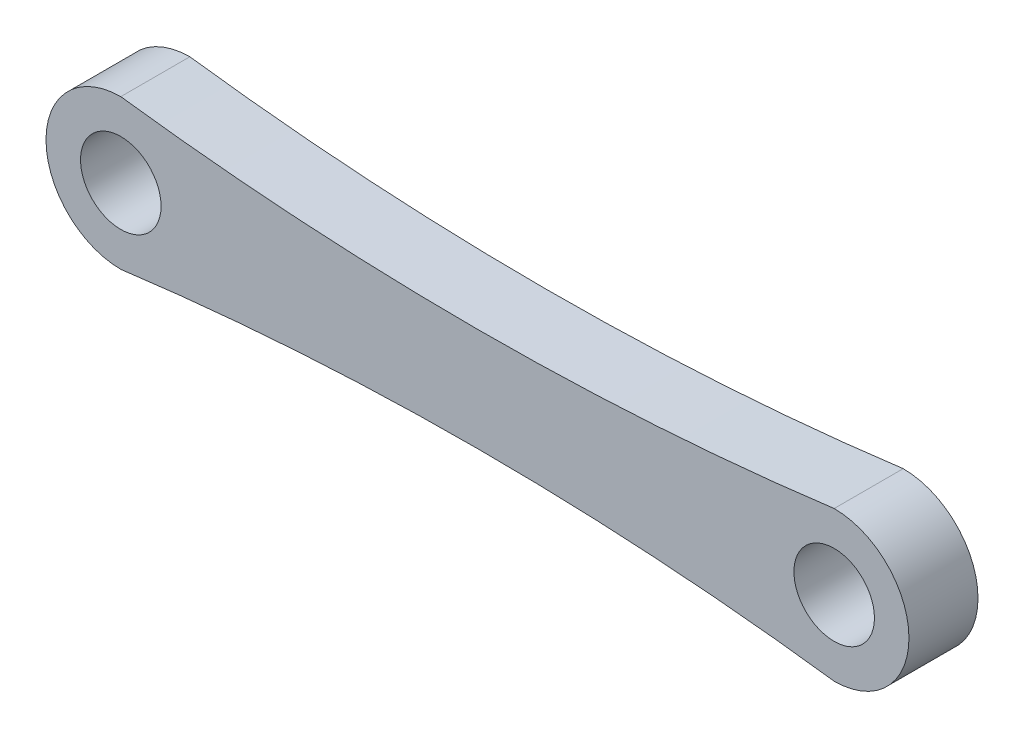
ISO-10303-21;
HEADER;
FILE_DESCRIPTION(('STEP AP214'),'2;1');
FILE_NAME('part.step','',(''),(''),'','','');
FILE_SCHEMA(('AUTOMOTIVE_DESIGN { 1 0 10303 214 1 1 1 1 }'));
ENDSEC;
DATA;
#1=APPLICATION_CONTEXT('core data for automotive mechanical design processes');
#2=APPLICATION_PROTOCOL_DEFINITION('international standard','automotive_design',2000,#1);
#3=PRODUCT_CONTEXT('',#1,'mechanical');
#4=PRODUCT('Part','Part','',(#3));
#5=PRODUCT_RELATED_PRODUCT_CATEGORY('part','',(#4));
#6=PRODUCT_DEFINITION_FORMATION('','',#4);
#7=PRODUCT_DEFINITION_CONTEXT('part definition',#1,'design');
#8=PRODUCT_DEFINITION('design','',#6,#7);
#9=PRODUCT_DEFINITION_SHAPE('','',#8);
#10=(LENGTH_UNIT() NAMED_UNIT(*) SI_UNIT(.MILLI.,.METRE.));
#11=(NAMED_UNIT(*) PLANE_ANGLE_UNIT() SI_UNIT($,.RADIAN.));
#12=(NAMED_UNIT(*) SI_UNIT($,.STERADIAN.) SOLID_ANGLE_UNIT());
#13=UNCERTAINTY_MEASURE_WITH_UNIT(LENGTH_MEASURE(1.E-05),#10,'distance_accuracy_value','');
#14=(GEOMETRIC_REPRESENTATION_CONTEXT(3) GLOBAL_UNCERTAINTY_ASSIGNED_CONTEXT((#13)) GLOBAL_UNIT_ASSIGNED_CONTEXT((#10,
#11,#12)) REPRESENTATION_CONTEXT('',''));
#15=CARTESIAN_POINT('',(0.,0.,0.));
#16=DIRECTION('',(0.,0.,1.));
#17=DIRECTION('',(1.,0.,0.));
#18=AXIS2_PLACEMENT_3D('',#15,#16,#17);
#19=CARTESIAN_POINT('',(-15.5,0.,-3.));
#20=DIRECTION('',(0.,0.,1.));
#21=DIRECTION('',(1.,0.,0.));
#22=AXIS2_PLACEMENT_3D('',#19,#20,#21);
#23=CYLINDRICAL_SURFACE('',#22,3.24999999999996);
#24=CARTESIAN_POINT('',(-15.5,0.,0.));
#25=DIRECTION('',(0.,0.,1.));
#26=DIRECTION('',(1.,0.,0.));
#27=AXIS2_PLACEMENT_3D('',#24,#25,#26);
#28=CIRCLE('',#27,3.24999999999996);
#29=CARTESIAN_POINT('',(-15.4999999999998,3.24999999999996,0.));
#30=VERTEX_POINT('',#29);
#31=CARTESIAN_POINT('',(-15.4999999999998,-3.24999999999996,0.));
#32=VERTEX_POINT('',#31);
#33=EDGE_CURVE('E113',#30,#32,#28,.T.);
#34=ORIENTED_EDGE('',*,*,#33,.F.);
#35=DIRECTION('',(0.,0.,1.));
#36=VECTOR('',#35,1.);
#37=CARTESIAN_POINT('',(-15.4999999999998,3.24999999999996,-3.));
#38=LINE('',#37,#36);
#39=CARTESIAN_POINT('',(-15.4999999999998,3.24999999999996,-3.));
#40=VERTEX_POINT('',#39);
#41=EDGE_CURVE('E11',#40,#30,#38,.T.);
#42=ORIENTED_EDGE('',*,*,#41,.F.);
#43=CARTESIAN_POINT('',(-15.5,0.,-3.));
#44=DIRECTION('',(0.,0.,1.));
#45=DIRECTION('',(1.,0.,0.));
#46=AXIS2_PLACEMENT_3D('',#43,#44,#45);
#47=CIRCLE('',#46,3.24999999999996);
#48=CARTESIAN_POINT('',(-15.4999999999998,-3.24999999999996,-3.));
#49=VERTEX_POINT('',#48);
#50=EDGE_CURVE('E105',#40,#49,#47,.T.);
#51=ORIENTED_EDGE('',*,*,#50,.T.);
#52=DIRECTION('',(0.,0.,1.));
#53=VECTOR('',#52,1.);
#54=CARTESIAN_POINT('',(-15.4999999999998,-3.24999999999996,-3.));
#55=LINE('',#54,#53);
#56=EDGE_CURVE('E44',#49,#32,#55,.T.);
#57=ORIENTED_EDGE('',*,*,#56,.T.);
#58=EDGE_LOOP('',(#34,#42,#51,#57));
#59=FACE_BOUND('',#58,.T.);
#60=ADVANCED_FACE('F41',(#59),#23,.T.);
#61=CARTESIAN_POINT('',(0.,122.244747783253,-3.));
#62=DIRECTION('',(0.,0.,1.));
#63=DIRECTION('',(1.,0.,0.));
#64=AXIS2_PLACEMENT_3D('',#61,#62,#63);
#65=CYLINDRICAL_SURFACE('',#64,120.);
#66=CARTESIAN_POINT('',(0.,122.244747783253,0.));
#67=DIRECTION('',(0.,0.,1.));
#68=DIRECTION('',(1.,0.,0.));
#69=AXIS2_PLACEMENT_3D('',#66,#67,#68);
#70=CIRCLE('',#69,120.);
#71=CARTESIAN_POINT('',(15.4999999999997,3.24999999999997,0.));
#72=VERTEX_POINT('',#71);
#73=EDGE_CURVE('E123',#30,#72,#70,.T.);
#74=ORIENTED_EDGE('',*,*,#73,.T.);
#75=DIRECTION('',(0.,0.,1.));
#76=VECTOR('',#75,1.);
#77=CARTESIAN_POINT('',(15.4999999999997,3.24999999999997,-3.));
#78=LINE('',#77,#76);
#79=CARTESIAN_POINT('',(15.4999999999997,3.24999999999997,-3.));
#80=VERTEX_POINT('',#79);
#81=EDGE_CURVE('E51',#80,#72,#78,.T.);
#82=ORIENTED_EDGE('',*,*,#81,.F.);
#83=CARTESIAN_POINT('',(0.,122.244747783253,-3.));
#84=DIRECTION('',(0.,0.,1.));
#85=DIRECTION('',(1.,0.,0.));
#86=AXIS2_PLACEMENT_3D('',#83,#84,#85);
#87=CIRCLE('',#86,120.);
#88=EDGE_CURVE('E94',#40,#80,#87,.T.);
#89=ORIENTED_EDGE('',*,*,#88,.F.);
#90=ORIENTED_EDGE('',*,*,#41,.T.);
#91=EDGE_LOOP('',(#74,#82,#89,#90));
#92=FACE_BOUND('',#91,.T.);
#93=ADVANCED_FACE('F125',(#92),#65,.F.);
#94=CARTESIAN_POINT('',(15.5,0.,-3.));
#95=DIRECTION('',(0.,0.,1.));
#96=DIRECTION('',(1.,0.,0.));
#97=AXIS2_PLACEMENT_3D('',#94,#95,#96);
#98=CYLINDRICAL_SURFACE('',#97,3.24999999999996);
#99=CARTESIAN_POINT('',(15.5,0.,0.));
#100=DIRECTION('',(0.,0.,1.));
#101=DIRECTION('',(1.,0.,0.));
#102=AXIS2_PLACEMENT_3D('',#99,#100,#101);
#103=CIRCLE('',#102,3.24999999999996);
#104=CARTESIAN_POINT('',(15.4999999999997,-3.24999999999996,0.));
#105=VERTEX_POINT('',#104);
#106=EDGE_CURVE('E78',#72,#105,#103,.F.);
#107=ORIENTED_EDGE('',*,*,#106,.T.);
#108=DIRECTION('',(0.,0.,1.));
#109=VECTOR('',#108,1.);
#110=CARTESIAN_POINT('',(15.4999999999997,-3.24999999999996,-3.));
#111=LINE('',#110,#109);
#112=CARTESIAN_POINT('',(15.4999999999997,-3.24999999999996,-3.));
#113=VERTEX_POINT('',#112);
#114=EDGE_CURVE('E98',#113,#105,#111,.T.);
#115=ORIENTED_EDGE('',*,*,#114,.F.);
#116=CARTESIAN_POINT('',(15.5,0.,-3.));
#117=DIRECTION('',(0.,0.,1.));
#118=DIRECTION('',(1.,0.,0.));
#119=AXIS2_PLACEMENT_3D('',#116,#117,#118);
#120=CIRCLE('',#119,3.24999999999996);
#121=EDGE_CURVE('E89',#80,#113,#120,.F.);
#122=ORIENTED_EDGE('',*,*,#121,.F.);
#123=ORIENTED_EDGE('',*,*,#81,.T.);
#124=EDGE_LOOP('',(#107,#115,#122,#123));
#125=FACE_BOUND('',#124,.T.);
#126=ADVANCED_FACE('F99',(#125),#98,.T.);
#127=CARTESIAN_POINT('',(-15.5,0.,-3.));
#128=DIRECTION('',(0.,0.,1.));
#129=DIRECTION('',(1.,0.,0.));
#130=AXIS2_PLACEMENT_3D('',#127,#128,#129);
#131=CYLINDRICAL_SURFACE('',#130,1.75);
#132=CARTESIAN_POINT('',(-15.5,0.,-3.));
#133=DIRECTION('',(0.,0.,1.));
#134=DIRECTION('',(1.,0.,0.));
#135=AXIS2_PLACEMENT_3D('',#132,#133,#134);
#136=CIRCLE('',#135,1.75);
#137=CARTESIAN_POINT('',(-13.75,0.,-3.));
#138=VERTEX_POINT('',#137);
#139=EDGE_CURVE('E101',#138,#138,#136,.T.);
#140=ORIENTED_EDGE('',*,*,#139,.F.);
#141=EDGE_LOOP('',(#140));
#142=FACE_BOUND('',#141,.T.);
#143=CARTESIAN_POINT('',(-15.5,0.,0.));
#144=DIRECTION('',(0.,0.,1.));
#145=DIRECTION('',(1.,0.,0.));
#146=AXIS2_PLACEMENT_3D('',#143,#144,#145);
#147=CIRCLE('',#146,1.75);
#148=CARTESIAN_POINT('',(-13.75,0.,0.));
#149=VERTEX_POINT('',#148);
#150=EDGE_CURVE('E115',#149,#149,#147,.T.);
#151=ORIENTED_EDGE('',*,*,#150,.T.);
#152=EDGE_LOOP('',(#151));
#153=FACE_BOUND('',#152,.T.);
#154=ADVANCED_FACE('F132',(#142,#153),#131,.F.);
#155=CARTESIAN_POINT('',(15.5,0.,-3.));
#156=DIRECTION('',(0.,0.,1.));
#157=DIRECTION('',(1.,0.,0.));
#158=AXIS2_PLACEMENT_3D('',#155,#156,#157);
#159=CYLINDRICAL_SURFACE('',#158,1.75);
#160=CARTESIAN_POINT('',(15.5,0.,-3.));
#161=DIRECTION('',(0.,0.,1.));
#162=DIRECTION('',(1.,0.,0.));
#163=AXIS2_PLACEMENT_3D('',#160,#161,#162);
#164=CIRCLE('',#163,1.75);
#165=CARTESIAN_POINT('',(17.25,0.,-3.));
#166=VERTEX_POINT('',#165);
#167=EDGE_CURVE('E122',#166,#166,#164,.F.);
#168=ORIENTED_EDGE('',*,*,#167,.T.);
#169=EDGE_LOOP('',(#168));
#170=FACE_BOUND('',#169,.T.);
#171=CARTESIAN_POINT('',(15.5,0.,0.));
#172=DIRECTION('',(0.,0.,1.));
#173=DIRECTION('',(1.,0.,0.));
#174=AXIS2_PLACEMENT_3D('',#171,#172,#173);
#175=CIRCLE('',#174,1.75);
#176=CARTESIAN_POINT('',(17.25,0.,0.));
#177=VERTEX_POINT('',#176);
#178=EDGE_CURVE('E108',#177,#177,#175,.F.);
#179=ORIENTED_EDGE('',*,*,#178,.F.);
#180=EDGE_LOOP('',(#179));
#181=FACE_BOUND('',#180,.T.);
#182=ADVANCED_FACE('F43',(#170,#181),#159,.F.);
#183=CARTESIAN_POINT('',(0.,-122.244747783253,-3.));
#184=DIRECTION('',(0.,0.,1.));
#185=DIRECTION('',(1.,0.,0.));
#186=AXIS2_PLACEMENT_3D('',#183,#184,#185);
#187=CYLINDRICAL_SURFACE('',#186,120.);
#188=CARTESIAN_POINT('',(0.,-122.244747783253,0.));
#189=DIRECTION('',(0.,0.,1.));
#190=DIRECTION('',(1.,0.,0.));
#191=AXIS2_PLACEMENT_3D('',#188,#189,#190);
#192=CIRCLE('',#191,120.);
#193=EDGE_CURVE('E119',#32,#105,#192,.F.);
#194=ORIENTED_EDGE('',*,*,#193,.F.);
#195=ORIENTED_EDGE('',*,*,#56,.F.);
#196=CARTESIAN_POINT('',(0.,-122.244747783253,-3.));
#197=DIRECTION('',(0.,0.,1.));
#198=DIRECTION('',(1.,0.,0.));
#199=AXIS2_PLACEMENT_3D('',#196,#197,#198);
#200=CIRCLE('',#199,120.);
#201=EDGE_CURVE('E92',#49,#113,#200,.F.);
#202=ORIENTED_EDGE('',*,*,#201,.T.);
#203=ORIENTED_EDGE('',*,*,#114,.T.);
#204=EDGE_LOOP('',(#194,#195,#202,#203));
#205=FACE_BOUND('',#204,.T.);
#206=ADVANCED_FACE('F102',(#205),#187,.F.);
#207=CARTESIAN_POINT('',(0.,0.,-3.));
#208=DIRECTION('',(0.,0.,1.));
#209=DIRECTION('',(1.,0.,0.));
#210=AXIS2_PLACEMENT_3D('',#207,#208,#209);
#211=PLANE('',#210);
#212=ORIENTED_EDGE('',*,*,#167,.F.);
#213=EDGE_LOOP('',(#212));
#214=FACE_BOUND('',#213,.T.);
#215=ORIENTED_EDGE('',*,*,#139,.T.);
#216=EDGE_LOOP('',(#215));
#217=FACE_BOUND('',#216,.T.);
#218=ORIENTED_EDGE('',*,*,#50,.F.);
#219=ORIENTED_EDGE('',*,*,#88,.T.);
#220=ORIENTED_EDGE('',*,*,#121,.T.);
#221=ORIENTED_EDGE('',*,*,#201,.F.);
#222=EDGE_LOOP('',(#218,#219,#220,#221));
#223=FACE_BOUND('',#222,.T.);
#224=ADVANCED_FACE('F93',(#214,#217,#223),#211,.F.);
#225=CARTESIAN_POINT('',(0.,0.,0.));
#226=DIRECTION('',(0.,0.,1.));
#227=DIRECTION('',(1.,0.,0.));
#228=AXIS2_PLACEMENT_3D('',#225,#226,#227);
#229=PLANE('',#228);
#230=ORIENTED_EDGE('',*,*,#178,.T.);
#231=EDGE_LOOP('',(#230));
#232=FACE_BOUND('',#231,.T.);
#233=ORIENTED_EDGE('',*,*,#150,.F.);
#234=EDGE_LOOP('',(#233));
#235=FACE_BOUND('',#234,.T.);
#236=ORIENTED_EDGE('',*,*,#33,.T.);
#237=ORIENTED_EDGE('',*,*,#193,.T.);
#238=ORIENTED_EDGE('',*,*,#106,.F.);
#239=ORIENTED_EDGE('',*,*,#73,.F.);
#240=EDGE_LOOP('',(#236,#237,#238,#239));
#241=FACE_BOUND('',#240,.T.);
#242=ADVANCED_FACE('F124',(#232,#235,#241),#229,.T.);
#243=CLOSED_SHELL('',(#60,#93,#126,#154,#182,#206,#224,#242));
#244=MANIFOLD_SOLID_BREP('B2',#243);
#245=ADVANCED_BREP_SHAPE_REPRESENTATION('',(#18,#244),#14);
#246=SHAPE_DEFINITION_REPRESENTATION(#9,#245);
ENDSEC;
END-ISO-10303-21;
